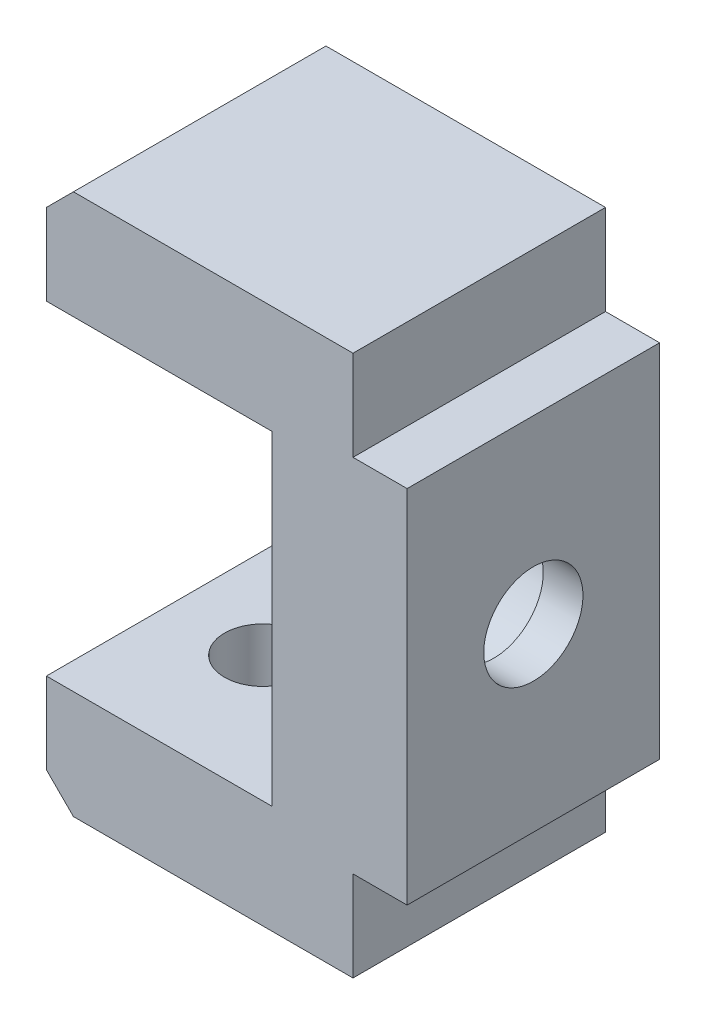
ISO-10303-21;
HEADER;
FILE_DESCRIPTION(('STEP AP214'),'2;1');
FILE_NAME('part.step','',(''),(''),'','','');
FILE_SCHEMA(('AUTOMOTIVE_DESIGN { 1 0 10303 214 1 1 1 1 }'));
ENDSEC;
DATA;
#1=APPLICATION_CONTEXT('core data for automotive mechanical design processes');
#2=APPLICATION_PROTOCOL_DEFINITION('international standard','automotive_design',2000,#1);
#3=PRODUCT_CONTEXT('',#1,'mechanical');
#4=PRODUCT('Part','Part','',(#3));
#5=PRODUCT_RELATED_PRODUCT_CATEGORY('part','',(#4));
#6=PRODUCT_DEFINITION_FORMATION('','',#4);
#7=PRODUCT_DEFINITION_CONTEXT('part definition',#1,'design');
#8=PRODUCT_DEFINITION('design','',#6,#7);
#9=PRODUCT_DEFINITION_SHAPE('','',#8);
#10=(LENGTH_UNIT() NAMED_UNIT(*) SI_UNIT(.MILLI.,.METRE.));
#11=(NAMED_UNIT(*) PLANE_ANGLE_UNIT() SI_UNIT($,.RADIAN.));
#12=(NAMED_UNIT(*) SI_UNIT($,.STERADIAN.) SOLID_ANGLE_UNIT());
#13=UNCERTAINTY_MEASURE_WITH_UNIT(LENGTH_MEASURE(1.E-05),#10,'distance_accuracy_value','');
#14=(GEOMETRIC_REPRESENTATION_CONTEXT(3) GLOBAL_UNCERTAINTY_ASSIGNED_CONTEXT((#13)) GLOBAL_UNIT_ASSIGNED_CONTEXT((#10,
#11,#12)) REPRESENTATION_CONTEXT('',''));
#15=CARTESIAN_POINT('',(0.,0.,0.));
#16=DIRECTION('',(0.,0.,1.));
#17=DIRECTION('',(1.,0.,0.));
#18=AXIS2_PLACEMENT_3D('',#15,#16,#17);
#19=CARTESIAN_POINT('',(-34.,0.,28.));
#20=DIRECTION('',(0.,1.,0.));
#21=DIRECTION('',(0.,0.,1.));
#22=AXIS2_PLACEMENT_3D('',#19,#20,#21);
#23=PLANE('',#22);
#24=CARTESIAN_POINT('',(-24.,0.,14.));
#25=DIRECTION('',(0.,1.,0.));
#26=DIRECTION('',(0.,0.,1.));
#27=AXIS2_PLACEMENT_3D('',#24,#25,#26);
#28=CIRCLE('',#27,6.);
#29=CARTESIAN_POINT('',(-24.,0.,20.));
#30=VERTEX_POINT('',#29);
#31=EDGE_CURVE('E468',#30,#30,#28,.T.);
#32=ORIENTED_EDGE('',*,*,#31,.T.);
#33=EDGE_LOOP('',(#32));
#34=FACE_BOUND('',#33,.T.);
#35=DIRECTION('',(1.,0.,0.));
#36=VECTOR('',#35,1.);
#37=CARTESIAN_POINT('',(-34.,0.,28.));
#38=LINE('',#37,#36);
#39=CARTESIAN_POINT('',(-31.,0.,28.));
#40=VERTEX_POINT('',#39);
#41=CARTESIAN_POINT('',(0.,0.,28.));
#42=VERTEX_POINT('',#41);
#43=EDGE_CURVE('E135',#40,#42,#38,.T.);
#44=ORIENTED_EDGE('',*,*,#43,.F.);
#45=DIRECTION('',(0.,0.,-1.));
#46=VECTOR('',#45,1.);
#47=CARTESIAN_POINT('',(-31.,0.,28.));
#48=LINE('',#47,#46);
#49=CARTESIAN_POINT('',(-31.,0.,0.));
#50=VERTEX_POINT('',#49);
#51=EDGE_CURVE('E161',#40,#50,#48,.T.);
#52=ORIENTED_EDGE('',*,*,#51,.T.);
#53=DIRECTION('',(1.,0.,0.));
#54=VECTOR('',#53,1.);
#55=CARTESIAN_POINT('',(-34.,0.,0.));
#56=LINE('',#55,#54);
#57=CARTESIAN_POINT('',(0.,0.,0.));
#58=VERTEX_POINT('',#57);
#59=EDGE_CURVE('E159',#50,#58,#56,.T.);
#60=ORIENTED_EDGE('',*,*,#59,.T.);
#61=DIRECTION('',(0.,0.,-1.));
#62=VECTOR('',#61,1.);
#63=CARTESIAN_POINT('',(0.,0.,28.));
#64=LINE('',#63,#62);
#65=EDGE_CURVE('E152',#42,#58,#64,.T.);
#66=ORIENTED_EDGE('',*,*,#65,.F.);
#67=EDGE_LOOP('',(#44,#52,#60,#66));
#68=FACE_BOUND('',#67,.T.);
#69=ADVANCED_FACE('F36',(#34,#68),#23,.F.);
#70=CARTESIAN_POINT('',(0.,0.,28.));
#71=DIRECTION('',(-1.,0.,0.));
#72=DIRECTION('',(0.,0.,1.));
#73=AXIS2_PLACEMENT_3D('',#70,#71,#72);
#74=PLANE('',#73);
#75=DIRECTION('',(0.,1.,0.));
#76=VECTOR('',#75,1.);
#77=CARTESIAN_POINT('',(0.,0.,0.));
#78=LINE('',#77,#76);
#79=CARTESIAN_POINT('',(0.,10.,0.));
#80=VERTEX_POINT('',#79);
#81=EDGE_CURVE('E241',#58,#80,#78,.T.);
#82=ORIENTED_EDGE('',*,*,#81,.T.);
#83=DIRECTION('',(0.,0.,-1.));
#84=VECTOR('',#83,1.);
#85=CARTESIAN_POINT('',(0.,10.,28.));
#86=LINE('',#85,#84);
#87=CARTESIAN_POINT('',(0.,10.,28.));
#88=VERTEX_POINT('',#87);
#89=EDGE_CURVE('E154',#88,#80,#86,.T.);
#90=ORIENTED_EDGE('',*,*,#89,.F.);
#91=DIRECTION('',(0.,1.,0.));
#92=VECTOR('',#91,1.);
#93=CARTESIAN_POINT('',(0.,0.,28.));
#94=LINE('',#93,#92);
#95=EDGE_CURVE('E139',#42,#88,#94,.T.);
#96=ORIENTED_EDGE('',*,*,#95,.F.);
#97=ORIENTED_EDGE('',*,*,#65,.T.);
#98=EDGE_LOOP('',(#82,#90,#96,#97));
#99=FACE_BOUND('',#98,.T.);
#100=ADVANCED_FACE('F151',(#99),#74,.F.);
#101=CARTESIAN_POINT('',(0.,10.,28.));
#102=DIRECTION('',(0.,1.,0.));
#103=DIRECTION('',(0.,0.,1.));
#104=AXIS2_PLACEMENT_3D('',#101,#102,#103);
#105=PLANE('',#104);
#106=DIRECTION('',(1.,0.,0.));
#107=VECTOR('',#106,1.);
#108=CARTESIAN_POINT('',(0.,10.,0.));
#109=LINE('',#108,#107);
#110=CARTESIAN_POINT('',(6.,10.,0.));
#111=VERTEX_POINT('',#110);
#112=EDGE_CURVE('E236',#80,#111,#109,.T.);
#113=ORIENTED_EDGE('',*,*,#112,.T.);
#114=DIRECTION('',(0.,0.,-1.));
#115=VECTOR('',#114,1.);
#116=CARTESIAN_POINT('',(6.,10.,28.));
#117=LINE('',#116,#115);
#118=CARTESIAN_POINT('',(6.,10.,28.));
#119=VERTEX_POINT('',#118);
#120=EDGE_CURVE('E165',#119,#111,#117,.T.);
#121=ORIENTED_EDGE('',*,*,#120,.F.);
#122=DIRECTION('',(1.,0.,0.));
#123=VECTOR('',#122,1.);
#124=CARTESIAN_POINT('',(0.,10.,28.));
#125=LINE('',#124,#123);
#126=EDGE_CURVE('E156',#88,#119,#125,.T.);
#127=ORIENTED_EDGE('',*,*,#126,.F.);
#128=ORIENTED_EDGE('',*,*,#89,.T.);
#129=EDGE_LOOP('',(#113,#121,#127,#128));
#130=FACE_BOUND('',#129,.T.);
#131=ADVANCED_FACE('F266',(#130),#105,.F.);
#132=CARTESIAN_POINT('',(6.,10.,28.));
#133=DIRECTION('',(-1.,0.,0.));
#134=DIRECTION('',(0.,0.,1.));
#135=AXIS2_PLACEMENT_3D('',#132,#133,#134);
#136=PLANE('',#135);
#137=CARTESIAN_POINT('',(6.,30.,14.));
#138=DIRECTION('',(-1.,0.,0.));
#139=DIRECTION('',(0.,0.,1.));
#140=AXIS2_PLACEMENT_3D('',#137,#138,#139);
#141=CIRCLE('',#140,5.49999999999999);
#142=CARTESIAN_POINT('',(6.,30.,19.5));
#143=VERTEX_POINT('',#142);
#144=EDGE_CURVE('E465',#143,#143,#141,.T.);
#145=ORIENTED_EDGE('',*,*,#144,.T.);
#146=EDGE_LOOP('',(#145));
#147=FACE_BOUND('',#146,.T.);
#148=DIRECTION('',(0.,1.,0.));
#149=VECTOR('',#148,1.);
#150=CARTESIAN_POINT('',(6.,10.,0.));
#151=LINE('',#150,#149);
#152=CARTESIAN_POINT('',(6.,50.,0.));
#153=VERTEX_POINT('',#152);
#154=EDGE_CURVE('E231',#111,#153,#151,.T.);
#155=ORIENTED_EDGE('',*,*,#154,.T.);
#156=DIRECTION('',(0.,0.,-1.));
#157=VECTOR('',#156,1.);
#158=CARTESIAN_POINT('',(6.,50.,28.));
#159=LINE('',#158,#157);
#160=CARTESIAN_POINT('',(6.,50.,28.));
#161=VERTEX_POINT('',#160);
#162=EDGE_CURVE('E222',#161,#153,#159,.T.);
#163=ORIENTED_EDGE('',*,*,#162,.F.);
#164=DIRECTION('',(0.,1.,0.));
#165=VECTOR('',#164,1.);
#166=CARTESIAN_POINT('',(6.,10.,28.));
#167=LINE('',#166,#165);
#168=EDGE_CURVE('E232',#119,#161,#167,.T.);
#169=ORIENTED_EDGE('',*,*,#168,.F.);
#170=ORIENTED_EDGE('',*,*,#120,.T.);
#171=EDGE_LOOP('',(#155,#163,#169,#170));
#172=FACE_BOUND('',#171,.T.);
#173=ADVANCED_FACE('F229',(#147,#172),#136,.F.);
#174=CARTESIAN_POINT('',(6.,50.,28.));
#175=DIRECTION('',(0.,-1.,0.));
#176=DIRECTION('',(0.,0.,-1.));
#177=AXIS2_PLACEMENT_3D('',#174,#175,#176);
#178=PLANE('',#177);
#179=DIRECTION('',(-1.,0.,0.));
#180=VECTOR('',#179,1.);
#181=CARTESIAN_POINT('',(6.,50.,0.));
#182=LINE('',#181,#180);
#183=CARTESIAN_POINT('',(0.,50.,0.));
#184=VERTEX_POINT('',#183);
#185=EDGE_CURVE('E238',#153,#184,#182,.T.);
#186=ORIENTED_EDGE('',*,*,#185,.T.);
#187=DIRECTION('',(0.,0.,-1.));
#188=VECTOR('',#187,1.);
#189=CARTESIAN_POINT('',(0.,50.,28.));
#190=LINE('',#189,#188);
#191=CARTESIAN_POINT('',(0.,50.,28.));
#192=VERTEX_POINT('',#191);
#193=EDGE_CURVE('E219',#192,#184,#190,.T.);
#194=ORIENTED_EDGE('',*,*,#193,.F.);
#195=DIRECTION('',(-1.,0.,0.));
#196=VECTOR('',#195,1.);
#197=CARTESIAN_POINT('',(6.,50.,28.));
#198=LINE('',#197,#196);
#199=EDGE_CURVE('E255',#161,#192,#198,.T.);
#200=ORIENTED_EDGE('',*,*,#199,.F.);
#201=ORIENTED_EDGE('',*,*,#162,.T.);
#202=EDGE_LOOP('',(#186,#194,#200,#201));
#203=FACE_BOUND('',#202,.T.);
#204=ADVANCED_FACE('F271',(#203),#178,.F.);
#205=CARTESIAN_POINT('',(0.,50.,28.));
#206=DIRECTION('',(-1.,0.,0.));
#207=DIRECTION('',(0.,0.,1.));
#208=AXIS2_PLACEMENT_3D('',#205,#206,#207);
#209=PLANE('',#208);
#210=DIRECTION('',(0.,1.,0.));
#211=VECTOR('',#210,1.);
#212=CARTESIAN_POINT('',(0.,50.,0.));
#213=LINE('',#212,#211);
#214=CARTESIAN_POINT('',(0.,60.,0.));
#215=VERTEX_POINT('',#214);
#216=EDGE_CURVE('E195',#184,#215,#213,.T.);
#217=ORIENTED_EDGE('',*,*,#216,.T.);
#218=DIRECTION('',(0.,0.,-1.));
#219=VECTOR('',#218,1.);
#220=CARTESIAN_POINT('',(0.,60.,28.));
#221=LINE('',#220,#219);
#222=CARTESIAN_POINT('',(0.,60.,28.));
#223=VERTEX_POINT('',#222);
#224=EDGE_CURVE('E216',#223,#215,#221,.T.);
#225=ORIENTED_EDGE('',*,*,#224,.F.);
#226=DIRECTION('',(0.,1.,0.));
#227=VECTOR('',#226,1.);
#228=CARTESIAN_POINT('',(0.,50.,28.));
#229=LINE('',#228,#227);
#230=EDGE_CURVE('E251',#192,#223,#229,.T.);
#231=ORIENTED_EDGE('',*,*,#230,.F.);
#232=ORIENTED_EDGE('',*,*,#193,.T.);
#233=EDGE_LOOP('',(#217,#225,#231,#232));
#234=FACE_BOUND('',#233,.T.);
#235=ADVANCED_FACE('F246',(#234),#209,.F.);
#236=CARTESIAN_POINT('',(0.,60.,28.));
#237=DIRECTION('',(0.,-1.,0.));
#238=DIRECTION('',(0.,0.,-1.));
#239=AXIS2_PLACEMENT_3D('',#236,#237,#238);
#240=PLANE('',#239);
#241=DIRECTION('',(-1.,0.,0.));
#242=VECTOR('',#241,1.);
#243=CARTESIAN_POINT('',(0.,60.,0.));
#244=LINE('',#243,#242);
#245=CARTESIAN_POINT('',(-31.,60.,0.));
#246=VERTEX_POINT('',#245);
#247=EDGE_CURVE('E191',#215,#246,#244,.T.);
#248=ORIENTED_EDGE('',*,*,#247,.T.);
#249=DIRECTION('',(0.,0.,1.));
#250=VECTOR('',#249,1.);
#251=CARTESIAN_POINT('',(-31.,60.,28.));
#252=LINE('',#251,#250);
#253=CARTESIAN_POINT('',(-31.,60.,28.));
#254=VERTEX_POINT('',#253);
#255=EDGE_CURVE('E11',#246,#254,#252,.T.);
#256=ORIENTED_EDGE('',*,*,#255,.T.);
#257=DIRECTION('',(-1.,0.,0.));
#258=VECTOR('',#257,1.);
#259=CARTESIAN_POINT('',(0.,60.,28.));
#260=LINE('',#259,#258);
#261=EDGE_CURVE('E250',#223,#254,#260,.T.);
#262=ORIENTED_EDGE('',*,*,#261,.F.);
#263=ORIENTED_EDGE('',*,*,#224,.T.);
#264=EDGE_LOOP('',(#248,#256,#262,#263));
#265=FACE_BOUND('',#264,.T.);
#266=ADVANCED_FACE('F249',(#265),#240,.F.);
#267=CARTESIAN_POINT('',(-34.,60.,28.));
#268=DIRECTION('',(1.,0.,0.));
#269=DIRECTION('',(0.,0.,-1.));
#270=AXIS2_PLACEMENT_3D('',#267,#268,#269);
#271=PLANE('',#270);
#272=DIRECTION('',(0.,-1.,0.));
#273=VECTOR('',#272,1.);
#274=CARTESIAN_POINT('',(-34.,60.,28.));
#275=LINE('',#274,#273);
#276=CARTESIAN_POINT('',(-34.,57.,28.));
#277=VERTEX_POINT('',#276);
#278=CARTESIAN_POINT('',(-34.,48.,28.));
#279=VERTEX_POINT('',#278);
#280=EDGE_CURVE('E183',#277,#279,#275,.T.);
#281=ORIENTED_EDGE('',*,*,#280,.F.);
#282=DIRECTION('',(0.,0.,-1.));
#283=VECTOR('',#282,1.);
#284=CARTESIAN_POINT('',(-34.,57.,28.));
#285=LINE('',#284,#283);
#286=CARTESIAN_POINT('',(-34.,57.,0.));
#287=VERTEX_POINT('',#286);
#288=EDGE_CURVE('E44',#277,#287,#285,.T.);
#289=ORIENTED_EDGE('',*,*,#288,.T.);
#290=DIRECTION('',(0.,-1.,0.));
#291=VECTOR('',#290,1.);
#292=CARTESIAN_POINT('',(-34.,60.,0.));
#293=LINE('',#292,#291);
#294=CARTESIAN_POINT('',(-34.,48.,0.));
#295=VERTEX_POINT('',#294);
#296=EDGE_CURVE('E181',#287,#295,#293,.T.);
#297=ORIENTED_EDGE('',*,*,#296,.T.);
#298=DIRECTION('',(0.,0.,-1.));
#299=VECTOR('',#298,1.);
#300=CARTESIAN_POINT('',(-34.,48.,28.));
#301=LINE('',#300,#299);
#302=EDGE_CURVE('E214',#279,#295,#301,.T.);
#303=ORIENTED_EDGE('',*,*,#302,.F.);
#304=EDGE_LOOP('',(#281,#289,#297,#303));
#305=FACE_BOUND('',#304,.T.);
#306=ADVANCED_FACE('F179',(#305),#271,.F.);
#307=CARTESIAN_POINT('',(-34.,48.,28.));
#308=DIRECTION('',(0.,1.,0.));
#309=DIRECTION('',(0.,0.,1.));
#310=AXIS2_PLACEMENT_3D('',#307,#308,#309);
#311=PLANE('',#310);
#312=DIRECTION('',(1.,0.,0.));
#313=VECTOR('',#312,1.);
#314=CARTESIAN_POINT('',(-34.,48.,0.));
#315=LINE('',#314,#313);
#316=CARTESIAN_POINT('',(-9.00000000000001,48.,0.));
#317=VERTEX_POINT('',#316);
#318=EDGE_CURVE('E190',#295,#317,#315,.T.);
#319=ORIENTED_EDGE('',*,*,#318,.T.);
#320=DIRECTION('',(0.,0.,-1.));
#321=VECTOR('',#320,1.);
#322=CARTESIAN_POINT('',(-9.00000000000001,48.,28.));
#323=LINE('',#322,#321);
#324=CARTESIAN_POINT('',(-9.00000000000001,48.,28.));
#325=VERTEX_POINT('',#324);
#326=EDGE_CURVE('E211',#325,#317,#323,.T.);
#327=ORIENTED_EDGE('',*,*,#326,.F.);
#328=DIRECTION('',(1.,0.,0.));
#329=VECTOR('',#328,1.);
#330=CARTESIAN_POINT('',(-34.,48.,28.));
#331=LINE('',#330,#329);
#332=EDGE_CURVE('E253',#279,#325,#331,.T.);
#333=ORIENTED_EDGE('',*,*,#332,.F.);
#334=ORIENTED_EDGE('',*,*,#302,.T.);
#335=EDGE_LOOP('',(#319,#327,#333,#334));
#336=FACE_BOUND('',#335,.T.);
#337=ADVANCED_FACE('F316',(#336),#311,.F.);
#338=CARTESIAN_POINT('',(-9.00000000000001,48.,28.));
#339=DIRECTION('',(1.,0.,0.));
#340=DIRECTION('',(0.,0.,-1.));
#341=AXIS2_PLACEMENT_3D('',#338,#339,#340);
#342=PLANE('',#341);
#343=CARTESIAN_POINT('',(-9.00000000000001,30.,14.));
#344=DIRECTION('',(-1.,0.,0.));
#345=DIRECTION('',(0.,0.,1.));
#346=AXIS2_PLACEMENT_3D('',#343,#344,#345);
#347=CIRCLE('',#346,9.);
#348=CARTESIAN_POINT('',(-9.00000000000001,30.,23.));
#349=VERTEX_POINT('',#348);
#350=EDGE_CURVE('E458',#349,#349,#347,.T.);
#351=ORIENTED_EDGE('',*,*,#350,.F.);
#352=EDGE_LOOP('',(#351));
#353=FACE_BOUND('',#352,.T.);
#354=DIRECTION('',(0.,-1.,0.));
#355=VECTOR('',#354,1.);
#356=CARTESIAN_POINT('',(-9.00000000000001,48.,0.));
#357=LINE('',#356,#355);
#358=CARTESIAN_POINT('',(-9.00000000000001,12.,0.));
#359=VERTEX_POINT('',#358);
#360=EDGE_CURVE('E193',#317,#359,#357,.T.);
#361=ORIENTED_EDGE('',*,*,#360,.T.);
#362=DIRECTION('',(0.,0.,-1.));
#363=VECTOR('',#362,1.);
#364=CARTESIAN_POINT('',(-9.00000000000001,12.,28.));
#365=LINE('',#364,#363);
#366=CARTESIAN_POINT('',(-9.00000000000001,12.,28.));
#367=VERTEX_POINT('',#366);
#368=EDGE_CURVE('E207',#367,#359,#365,.T.);
#369=ORIENTED_EDGE('',*,*,#368,.F.);
#370=DIRECTION('',(0.,-1.,0.));
#371=VECTOR('',#370,1.);
#372=CARTESIAN_POINT('',(-9.00000000000001,48.,28.));
#373=LINE('',#372,#371);
#374=EDGE_CURVE('E260',#325,#367,#373,.T.);
#375=ORIENTED_EDGE('',*,*,#374,.F.);
#376=ORIENTED_EDGE('',*,*,#326,.T.);
#377=EDGE_LOOP('',(#361,#369,#375,#376));
#378=FACE_BOUND('',#377,.T.);
#379=ADVANCED_FACE('F311',(#353,#378),#342,.F.);
#380=CARTESIAN_POINT('',(-9.00000000000001,12.,28.));
#381=DIRECTION('',(0.,-1.,0.));
#382=DIRECTION('',(0.,0.,-1.));
#383=AXIS2_PLACEMENT_3D('',#380,#381,#382);
#384=PLANE('',#383);
#385=CARTESIAN_POINT('',(-24.,12.,14.));
#386=DIRECTION('',(0.,1.,0.));
#387=DIRECTION('',(0.,0.,1.));
#388=AXIS2_PLACEMENT_3D('',#385,#386,#387);
#389=CIRCLE('',#388,4.24999999999999);
#390=CARTESIAN_POINT('',(-24.,12.,18.25));
#391=VERTEX_POINT('',#390);
#392=EDGE_CURVE('E470',#391,#391,#389,.T.);
#393=ORIENTED_EDGE('',*,*,#392,.F.);
#394=EDGE_LOOP('',(#393));
#395=FACE_BOUND('',#394,.T.);
#396=DIRECTION('',(-1.,0.,0.));
#397=VECTOR('',#396,1.);
#398=CARTESIAN_POINT('',(-9.00000000000001,12.,0.));
#399=LINE('',#398,#397);
#400=CARTESIAN_POINT('',(-34.,12.,0.));
#401=VERTEX_POINT('',#400);
#402=EDGE_CURVE('E200',#359,#401,#399,.T.);
#403=ORIENTED_EDGE('',*,*,#402,.T.);
#404=DIRECTION('',(0.,0.,-1.));
#405=VECTOR('',#404,1.);
#406=CARTESIAN_POINT('',(-34.,12.,28.));
#407=LINE('',#406,#405);
#408=CARTESIAN_POINT('',(-34.,12.,28.));
#409=VERTEX_POINT('',#408);
#410=EDGE_CURVE('E204',#409,#401,#407,.T.);
#411=ORIENTED_EDGE('',*,*,#410,.F.);
#412=DIRECTION('',(-1.,0.,0.));
#413=VECTOR('',#412,1.);
#414=CARTESIAN_POINT('',(-9.00000000000001,12.,28.));
#415=LINE('',#414,#413);
#416=EDGE_CURVE('E262',#367,#409,#415,.T.);
#417=ORIENTED_EDGE('',*,*,#416,.F.);
#418=ORIENTED_EDGE('',*,*,#368,.T.);
#419=EDGE_LOOP('',(#403,#411,#417,#418));
#420=FACE_BOUND('',#419,.T.);
#421=ADVANCED_FACE('F308',(#395,#420),#384,.F.);
#422=CARTESIAN_POINT('',(-34.,12.,28.));
#423=DIRECTION('',(1.,0.,0.));
#424=DIRECTION('',(0.,0.,-1.));
#425=AXIS2_PLACEMENT_3D('',#422,#423,#424);
#426=PLANE('',#425);
#427=DIRECTION('',(0.,-1.,0.));
#428=VECTOR('',#427,1.);
#429=CARTESIAN_POINT('',(-34.,12.,0.));
#430=LINE('',#429,#428);
#431=CARTESIAN_POINT('',(-34.,3.00000000000001,0.));
#432=VERTEX_POINT('',#431);
#433=EDGE_CURVE('E147',#401,#432,#430,.T.);
#434=ORIENTED_EDGE('',*,*,#433,.T.);
#435=DIRECTION('',(0.,0.,1.));
#436=VECTOR('',#435,1.);
#437=CARTESIAN_POINT('',(-34.,3.00000000000001,28.));
#438=LINE('',#437,#436);
#439=CARTESIAN_POINT('',(-34.,3.00000000000001,28.));
#440=VERTEX_POINT('',#439);
#441=EDGE_CURVE('E172',#432,#440,#438,.T.);
#442=ORIENTED_EDGE('',*,*,#441,.T.);
#443=DIRECTION('',(0.,-1.,0.));
#444=VECTOR('',#443,1.);
#445=CARTESIAN_POINT('',(-34.,12.,28.));
#446=LINE('',#445,#444);
#447=EDGE_CURVE('E208',#409,#440,#446,.T.);
#448=ORIENTED_EDGE('',*,*,#447,.F.);
#449=ORIENTED_EDGE('',*,*,#410,.T.);
#450=EDGE_LOOP('',(#434,#442,#448,#449));
#451=FACE_BOUND('',#450,.T.);
#452=ADVANCED_FACE('F303',(#451),#426,.F.);
#453=CARTESIAN_POINT('',(0.,0.,28.));
#454=DIRECTION('',(0.,0.,1.));
#455=DIRECTION('',(1.,0.,0.));
#456=AXIS2_PLACEMENT_3D('',#453,#454,#455);
#457=PLANE('',#456);
#458=ORIENTED_EDGE('',*,*,#447,.T.);
#459=DIRECTION('',(-0.707106781186546,0.707106781186549,0.));
#460=VECTOR('',#459,1.);
#461=CARTESIAN_POINT('',(-15.5000000000001,-15.5,28.));
#462=LINE('',#461,#460);
#463=EDGE_CURVE('E142',#440,#40,#462,.F.);
#464=ORIENTED_EDGE('',*,*,#463,.T.);
#465=ORIENTED_EDGE('',*,*,#43,.T.);
#466=ORIENTED_EDGE('',*,*,#95,.T.);
#467=ORIENTED_EDGE('',*,*,#126,.T.);
#468=ORIENTED_EDGE('',*,*,#168,.T.);
#469=ORIENTED_EDGE('',*,*,#199,.T.);
#470=ORIENTED_EDGE('',*,*,#230,.T.);
#471=ORIENTED_EDGE('',*,*,#261,.T.);
#472=DIRECTION('',(0.707106781186549,0.707106781186546,0.));
#473=VECTOR('',#472,1.);
#474=CARTESIAN_POINT('',(-45.4999999999999,45.5000000000001,28.));
#475=LINE('',#474,#473);
#476=EDGE_CURVE('E51',#254,#277,#475,.F.);
#477=ORIENTED_EDGE('',*,*,#476,.T.);
#478=ORIENTED_EDGE('',*,*,#280,.T.);
#479=ORIENTED_EDGE('',*,*,#332,.T.);
#480=ORIENTED_EDGE('',*,*,#374,.T.);
#481=ORIENTED_EDGE('',*,*,#416,.T.);
#482=EDGE_LOOP('',(#458,#464,#465,#466,#467,#468,#469,#470,#471,#477,#478,#479,#480,#481));
#483=FACE_BOUND('',#482,.T.);
#484=ADVANCED_FACE('F138',(#483),#457,.T.);
#485=CARTESIAN_POINT('',(0.,0.,0.));
#486=DIRECTION('',(0.,0.,1.));
#487=DIRECTION('',(1.,0.,0.));
#488=AXIS2_PLACEMENT_3D('',#485,#486,#487);
#489=PLANE('',#488);
#490=ORIENTED_EDGE('',*,*,#59,.F.);
#491=DIRECTION('',(0.707106781186546,-0.707106781186549,0.));
#492=VECTOR('',#491,1.);
#493=CARTESIAN_POINT('',(-31.,0.,0.));
#494=LINE('',#493,#492);
#495=EDGE_CURVE('E170',#50,#432,#494,.F.);
#496=ORIENTED_EDGE('',*,*,#495,.T.);
#497=ORIENTED_EDGE('',*,*,#433,.F.);
#498=ORIENTED_EDGE('',*,*,#402,.F.);
#499=ORIENTED_EDGE('',*,*,#360,.F.);
#500=ORIENTED_EDGE('',*,*,#318,.F.);
#501=ORIENTED_EDGE('',*,*,#296,.F.);
#502=DIRECTION('',(-0.707106781186549,-0.707106781186546,0.));
#503=VECTOR('',#502,1.);
#504=CARTESIAN_POINT('',(-34.,57.,0.));
#505=LINE('',#504,#503);
#506=EDGE_CURVE('E163',#287,#246,#505,.F.);
#507=ORIENTED_EDGE('',*,*,#506,.T.);
#508=ORIENTED_EDGE('',*,*,#247,.F.);
#509=ORIENTED_EDGE('',*,*,#216,.F.);
#510=ORIENTED_EDGE('',*,*,#185,.F.);
#511=ORIENTED_EDGE('',*,*,#154,.F.);
#512=ORIENTED_EDGE('',*,*,#112,.F.);
#513=ORIENTED_EDGE('',*,*,#81,.F.);
#514=EDGE_LOOP('',(#490,#496,#497,#498,#499,#500,#501,#507,#508,#509,#510,#511,#512,#513));
#515=FACE_BOUND('',#514,.T.);
#516=ADVANCED_FACE('F187',(#515),#489,.F.);
#517=CARTESIAN_POINT('',(-31.,0.,28.));
#518=DIRECTION('',(0.707106781186549,0.707106781186546,0.));
#519=DIRECTION('',(0.,0.,-1.));
#520=AXIS2_PLACEMENT_3D('',#517,#518,#519);
#521=PLANE('',#520);
#522=ORIENTED_EDGE('',*,*,#463,.F.);
#523=ORIENTED_EDGE('',*,*,#441,.F.);
#524=ORIENTED_EDGE('',*,*,#495,.F.);
#525=ORIENTED_EDGE('',*,*,#51,.F.);
#526=EDGE_LOOP('',(#522,#523,#524,#525));
#527=FACE_BOUND('',#526,.T.);
#528=ADVANCED_FACE('F290',(#527),#521,.F.);
#529=CARTESIAN_POINT('',(-34.,57.,28.));
#530=DIRECTION('',(0.707106781186546,-0.707106781186549,0.));
#531=DIRECTION('',(0.,0.,-1.));
#532=AXIS2_PLACEMENT_3D('',#529,#530,#531);
#533=PLANE('',#532);
#534=ORIENTED_EDGE('',*,*,#476,.F.);
#535=ORIENTED_EDGE('',*,*,#255,.F.);
#536=ORIENTED_EDGE('',*,*,#506,.F.);
#537=ORIENTED_EDGE('',*,*,#288,.F.);
#538=EDGE_LOOP('',(#534,#535,#536,#537));
#539=FACE_BOUND('',#538,.T.);
#540=ADVANCED_FACE('F38',(#539),#533,.F.);
#541=CARTESIAN_POINT('',(-24.,1.01036297108185,14.));
#542=DIRECTION('',(0.,-1.,0.));
#543=DIRECTION('',(0.,0.,-1.));
#544=AXIS2_PLACEMENT_3D('',#541,#542,#543);
#545=CONICAL_SURFACE('',#544,4.24999999999999,1.0471975511966);
#546=ORIENTED_EDGE('',*,*,#31,.F.);
#547=EDGE_LOOP('',(#546));
#548=FACE_BOUND('',#547,.T.);
#549=CARTESIAN_POINT('',(-24.,1.01036297108185,14.));
#550=DIRECTION('',(0.,1.,0.));
#551=DIRECTION('',(0.,0.,1.));
#552=AXIS2_PLACEMENT_3D('',#549,#550,#551);
#553=CIRCLE('',#552,4.24999999999999);
#554=CARTESIAN_POINT('',(-24.,1.01036297108185,18.25));
#555=VERTEX_POINT('',#554);
#556=EDGE_CURVE('E265',#555,#555,#553,.T.);
#557=ORIENTED_EDGE('',*,*,#556,.T.);
#558=EDGE_LOOP('',(#557));
#559=FACE_BOUND('',#558,.T.);
#560=ADVANCED_FACE('F297',(#548,#559),#545,.F.);
#561=CARTESIAN_POINT('',(-24.,12.,14.));
#562=DIRECTION('',(0.,1.,0.));
#563=DIRECTION('',(0.,0.,1.));
#564=AXIS2_PLACEMENT_3D('',#561,#562,#563);
#565=CYLINDRICAL_SURFACE('',#564,4.24999999999999);
#566=ORIENTED_EDGE('',*,*,#556,.F.);
#567=EDGE_LOOP('',(#566));
#568=FACE_BOUND('',#567,.T.);
#569=ORIENTED_EDGE('',*,*,#392,.T.);
#570=EDGE_LOOP('',(#569));
#571=FACE_BOUND('',#570,.T.);
#572=ADVANCED_FACE('F393',(#568,#571),#565,.F.);
#573=CARTESIAN_POINT('',(-9.00000000000001,30.,14.));
#574=DIRECTION('',(-1.,0.,0.));
#575=DIRECTION('',(0.,0.,1.));
#576=AXIS2_PLACEMENT_3D('',#573,#574,#575);
#577=CYLINDRICAL_SURFACE('',#576,5.5);
#578=ORIENTED_EDGE('',*,*,#144,.F.);
#579=EDGE_LOOP('',(#578));
#580=FACE_BOUND('',#579,.T.);
#581=CARTESIAN_POINT('',(1.59999999999999,30.,14.));
#582=DIRECTION('',(-1.,0.,0.));
#583=DIRECTION('',(0.,0.,1.));
#584=AXIS2_PLACEMENT_3D('',#581,#582,#583);
#585=CIRCLE('',#584,5.50000000000001);
#586=CARTESIAN_POINT('',(1.59999999999999,30.,19.5));
#587=VERTEX_POINT('',#586);
#588=EDGE_CURVE('E460',#587,#587,#585,.T.);
#589=ORIENTED_EDGE('',*,*,#588,.T.);
#590=EDGE_LOOP('',(#589));
#591=FACE_BOUND('',#590,.T.);
#592=ADVANCED_FACE('F404',(#580,#591),#577,.F.);
#593=CARTESIAN_POINT('',(1.59999999999999,35.5,14.));
#594=DIRECTION('',(1.,0.,0.));
#595=DIRECTION('',(0.,0.,-1.));
#596=AXIS2_PLACEMENT_3D('',#593,#594,#595);
#597=PLANE('',#596);
#598=ORIENTED_EDGE('',*,*,#588,.F.);
#599=EDGE_LOOP('',(#598));
#600=FACE_BOUND('',#599,.T.);
#601=CARTESIAN_POINT('',(1.59999999999999,30.,14.));
#602=DIRECTION('',(-1.,0.,0.));
#603=DIRECTION('',(0.,0.,1.));
#604=AXIS2_PLACEMENT_3D('',#601,#602,#603);
#605=CIRCLE('',#604,9.);
#606=CARTESIAN_POINT('',(1.59999999999999,30.,23.));
#607=VERTEX_POINT('',#606);
#608=EDGE_CURVE('E455',#607,#607,#605,.T.);
#609=ORIENTED_EDGE('',*,*,#608,.T.);
#610=EDGE_LOOP('',(#609));
#611=FACE_BOUND('',#610,.T.);
#612=ADVANCED_FACE('F428',(#600,#611),#597,.F.);
#613=CARTESIAN_POINT('',(-9.00000000000001,30.,14.));
#614=DIRECTION('',(-1.,0.,0.));
#615=DIRECTION('',(0.,0.,1.));
#616=AXIS2_PLACEMENT_3D('',#613,#614,#615);
#617=CYLINDRICAL_SURFACE('',#616,9.);
#618=ORIENTED_EDGE('',*,*,#608,.F.);
#619=EDGE_LOOP('',(#618));
#620=FACE_BOUND('',#619,.T.);
#621=ORIENTED_EDGE('',*,*,#350,.T.);
#622=EDGE_LOOP('',(#621));
#623=FACE_BOUND('',#622,.T.);
#624=ADVANCED_FACE('F438',(#620,#623),#617,.F.);
#625=CLOSED_SHELL('',(#69,#100,#131,#173,#204,#235,#266,#306,#337,#379,#421,#452,#484,#516,#528,
#540,#560,#572,#592,#612,#624));
#626=MANIFOLD_SOLID_BREP('B2',#625);
#627=ADVANCED_BREP_SHAPE_REPRESENTATION('',(#18,#626),#14);
#628=SHAPE_DEFINITION_REPRESENTATION(#9,#627);
ENDSEC;
END-ISO-10303-21;
